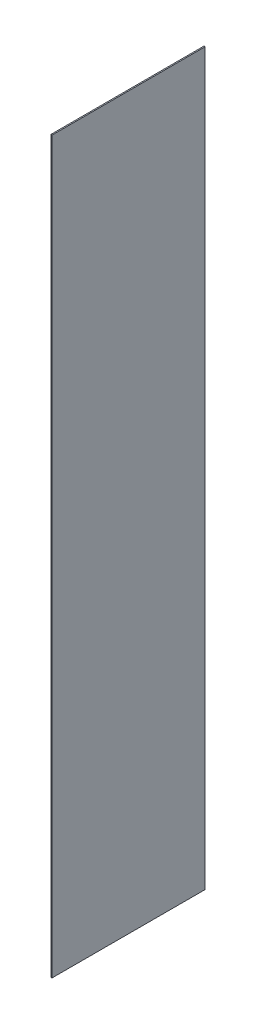
ISO-10303-21;
HEADER;
FILE_DESCRIPTION(('STEP AP214'),'2;1');
FILE_NAME('part.step','',(''),(''),'','','');
FILE_SCHEMA(('AUTOMOTIVE_DESIGN { 1 0 10303 214 1 1 1 1 }'));
ENDSEC;
DATA;
#1=APPLICATION_CONTEXT('core data for automotive mechanical design processes');
#2=APPLICATION_PROTOCOL_DEFINITION('international standard','automotive_design',2000,#1);
#3=PRODUCT_CONTEXT('',#1,'mechanical');
#4=PRODUCT('Part','Part','',(#3));
#5=PRODUCT_RELATED_PRODUCT_CATEGORY('part','',(#4));
#6=PRODUCT_DEFINITION_FORMATION('','',#4);
#7=PRODUCT_DEFINITION_CONTEXT('part definition',#1,'design');
#8=PRODUCT_DEFINITION('design','',#6,#7);
#9=PRODUCT_DEFINITION_SHAPE('','',#8);
#10=(LENGTH_UNIT() NAMED_UNIT(*) SI_UNIT(.MILLI.,.METRE.));
#11=(NAMED_UNIT(*) PLANE_ANGLE_UNIT() SI_UNIT($,.RADIAN.));
#12=(NAMED_UNIT(*) SI_UNIT($,.STERADIAN.) SOLID_ANGLE_UNIT());
#13=UNCERTAINTY_MEASURE_WITH_UNIT(LENGTH_MEASURE(1.E-05),#10,'distance_accuracy_value','');
#14=(GEOMETRIC_REPRESENTATION_CONTEXT(3) GLOBAL_UNCERTAINTY_ASSIGNED_CONTEXT((#13)) GLOBAL_UNIT_ASSIGNED_CONTEXT((#10,
#11,#12)) REPRESENTATION_CONTEXT('',''));
#15=CARTESIAN_POINT('',(0.,0.,0.));
#16=DIRECTION('',(0.,0.,1.));
#17=DIRECTION('',(1.,0.,0.));
#18=AXIS2_PLACEMENT_3D('',#15,#16,#17);
#19=CARTESIAN_POINT('',(823.,-991.,1915.));
#20=DIRECTION('',(1.,0.,0.));
#21=DIRECTION('',(0.,0.,1.));
#22=AXIS2_PLACEMENT_3D('',#19,#20,#21);
#23=PLANE('',#22);
#24=DIRECTION('',(0.,1.,0.));
#25=VECTOR('',#24,1.);
#26=CARTESIAN_POINT('',(823.,-985.,1739.));
#27=LINE('',#26,#25);
#28=CARTESIAN_POINT('',(823.,-985.,1739.));
#29=VERTEX_POINT('',#28);
#30=CARTESIAN_POINT('',(823.,-175.,1739.));
#31=VERTEX_POINT('',#30);
#32=EDGE_CURVE('E11',#29,#31,#27,.T.);
#33=ORIENTED_EDGE('',*,*,#32,.T.);
#34=DIRECTION('',(0.,0.,1.));
#35=VECTOR('',#34,1.);
#36=CARTESIAN_POINT('',(823.,-175.,1739.));
#37=LINE('',#36,#35);
#38=CARTESIAN_POINT('',(823.,-175.,1909.));
#39=VERTEX_POINT('',#38);
#40=EDGE_CURVE('E27',#31,#39,#37,.T.);
#41=ORIENTED_EDGE('',*,*,#40,.T.);
#42=DIRECTION('',(0.,-1.,0.));
#43=VECTOR('',#42,1.);
#44=CARTESIAN_POINT('',(823.,-175.,1909.));
#45=LINE('',#44,#43);
#46=CARTESIAN_POINT('',(823.,-985.,1909.));
#47=VERTEX_POINT('',#46);
#48=EDGE_CURVE('E103',#39,#47,#45,.T.);
#49=ORIENTED_EDGE('',*,*,#48,.T.);
#50=DIRECTION('',(0.,0.,-1.));
#51=VECTOR('',#50,1.);
#52=CARTESIAN_POINT('',(823.,-985.,1909.));
#53=LINE('',#52,#51);
#54=EDGE_CURVE('E106',#47,#29,#53,.T.);
#55=ORIENTED_EDGE('',*,*,#54,.T.);
#56=EDGE_LOOP('',(#33,#41,#49,#55));
#57=FACE_BOUND('',#56,.T.);
#58=ADVANCED_FACE('F17',(#57),#23,.T.);
#59=CARTESIAN_POINT('',(823.,-985.,1909.));
#60=DIRECTION('',(0.,-1.,0.));
#61=DIRECTION('',(1.,0.,0.));
#62=AXIS2_PLACEMENT_3D('',#59,#60,#61);
#63=PLANE('',#62);
#64=DIRECTION('',(-1.,0.,0.));
#65=VECTOR('',#64,1.);
#66=CARTESIAN_POINT('',(823.,-985.,1739.));
#67=LINE('',#66,#65);
#68=CARTESIAN_POINT('',(821.7,-985.,1739.));
#69=VERTEX_POINT('',#68);
#70=EDGE_CURVE('E94',#29,#69,#67,.T.);
#71=ORIENTED_EDGE('',*,*,#70,.F.);
#72=ORIENTED_EDGE('',*,*,#54,.F.);
#73=DIRECTION('',(-1.,0.,0.));
#74=VECTOR('',#73,1.);
#75=CARTESIAN_POINT('',(823.,-985.,1909.));
#76=LINE('',#75,#74);
#77=CARTESIAN_POINT('',(821.7,-985.,1909.));
#78=VERTEX_POINT('',#77);
#79=EDGE_CURVE('E107',#47,#78,#76,.T.);
#80=ORIENTED_EDGE('',*,*,#79,.T.);
#81=DIRECTION('',(0.,0.,1.));
#82=VECTOR('',#81,1.);
#83=CARTESIAN_POINT('',(821.7,-985.,1739.));
#84=LINE('',#83,#82);
#85=EDGE_CURVE('E114',#69,#78,#84,.T.);
#86=ORIENTED_EDGE('',*,*,#85,.F.);
#87=EDGE_LOOP('',(#71,#72,#80,#86));
#88=FACE_BOUND('',#87,.T.);
#89=ADVANCED_FACE('F138',(#88),#63,.T.);
#90=CARTESIAN_POINT('',(821.35,-984.65,1824.));
#91=DIRECTION('',(-0.707106781186548,-0.707106781186548,0.));
#92=DIRECTION('',(0.,0.,1.));
#93=AXIS2_PLACEMENT_3D('',#90,#91,#92);
#94=PLANE('',#93);
#95=DIRECTION('',(-0.577350269189626,0.577350269189626,-0.577350269189626));
#96=VECTOR('',#95,1.);
#97=CARTESIAN_POINT('',(821.7,-985.,1909.));
#98=LINE('',#97,#96);
#99=CARTESIAN_POINT('',(821.,-984.3,1908.3));
#100=VERTEX_POINT('',#99);
#101=EDGE_CURVE('E72',#78,#100,#98,.T.);
#102=ORIENTED_EDGE('',*,*,#101,.T.);
#103=DIRECTION('',(0.,0.,1.));
#104=VECTOR('',#103,1.);
#105=CARTESIAN_POINT('',(821.,-984.3,1739.7));
#106=LINE('',#105,#104);
#107=CARTESIAN_POINT('',(821.,-984.3,1739.7));
#108=VERTEX_POINT('',#107);
#109=EDGE_CURVE('E66',#108,#100,#106,.T.);
#110=ORIENTED_EDGE('',*,*,#109,.F.);
#111=DIRECTION('',(-0.577350269189626,0.577350269189626,0.577350269189626));
#112=VECTOR('',#111,1.);
#113=CARTESIAN_POINT('',(821.7,-985.,1739.));
#114=LINE('',#113,#112);
#115=EDGE_CURVE('E69',#69,#108,#114,.T.);
#116=ORIENTED_EDGE('',*,*,#115,.F.);
#117=ORIENTED_EDGE('',*,*,#85,.T.);
#118=EDGE_LOOP('',(#102,#110,#116,#117));
#119=FACE_BOUND('',#118,.T.);
#120=ADVANCED_FACE('F68',(#119),#94,.T.);
#121=CARTESIAN_POINT('',(821.35,-580.,1739.35));
#122=DIRECTION('',(-0.707106781186498,0.,-0.707106781186598));
#123=DIRECTION('',(-0.707106781186598,0.,0.707106781186498));
#124=AXIS2_PLACEMENT_3D('',#121,#122,#123);
#125=PLANE('',#124);
#126=DIRECTION('',(-0.577350269189592,-0.577350269189693,0.577350269189592));
#127=VECTOR('',#126,1.);
#128=CARTESIAN_POINT('',(821.7,-175.,1739.));
#129=LINE('',#128,#127);
#130=CARTESIAN_POINT('',(821.7,-175.,1739.));
#131=VERTEX_POINT('',#130);
#132=CARTESIAN_POINT('',(821.,-175.7,1739.7));
#133=VERTEX_POINT('',#132);
#134=EDGE_CURVE('E99',#131,#133,#129,.T.);
#135=ORIENTED_EDGE('',*,*,#134,.F.);
#136=DIRECTION('',(0.,-1.,0.));
#137=VECTOR('',#136,1.);
#138=CARTESIAN_POINT('',(821.7,-175.,1739.));
#139=LINE('',#138,#137);
#140=EDGE_CURVE('E85',#131,#69,#139,.T.);
#141=ORIENTED_EDGE('',*,*,#140,.T.);
#142=ORIENTED_EDGE('',*,*,#115,.T.);
#143=DIRECTION('',(0.,-1.,0.));
#144=VECTOR('',#143,1.);
#145=CARTESIAN_POINT('',(821.,-175.7,1739.7));
#146=LINE('',#145,#144);
#147=EDGE_CURVE('E76',#133,#108,#146,.T.);
#148=ORIENTED_EDGE('',*,*,#147,.F.);
#149=EDGE_LOOP('',(#135,#141,#142,#148));
#150=FACE_BOUND('',#149,.T.);
#151=ADVANCED_FACE('F82',(#150),#125,.T.);
#152=CARTESIAN_POINT('',(821.,-991.,1915.));
#153=DIRECTION('',(1.,0.,0.));
#154=DIRECTION('',(0.,0.,1.));
#155=AXIS2_PLACEMENT_3D('',#152,#153,#154);
#156=PLANE('',#155);
#157=DIRECTION('',(0.,0.,-1.));
#158=VECTOR('',#157,1.);
#159=CARTESIAN_POINT('',(821.,-175.7,1908.3));
#160=LINE('',#159,#158);
#161=CARTESIAN_POINT('',(821.,-175.7,1908.3));
#162=VERTEX_POINT('',#161);
#163=EDGE_CURVE('E86',#162,#133,#160,.T.);
#164=ORIENTED_EDGE('',*,*,#163,.T.);
#165=ORIENTED_EDGE('',*,*,#147,.T.);
#166=ORIENTED_EDGE('',*,*,#109,.T.);
#167=DIRECTION('',(0.,1.,0.));
#168=VECTOR('',#167,1.);
#169=CARTESIAN_POINT('',(821.,-984.3,1908.3));
#170=LINE('',#169,#168);
#171=EDGE_CURVE('E77',#100,#162,#170,.T.);
#172=ORIENTED_EDGE('',*,*,#171,.T.);
#173=EDGE_LOOP('',(#164,#165,#166,#172));
#174=FACE_BOUND('',#173,.T.);
#175=ADVANCED_FACE('F88',(#174),#156,.F.);
#176=CARTESIAN_POINT('',(821.35,-580.,1908.65));
#177=DIRECTION('',(-0.707106781186548,0.,0.707106781186548));
#178=DIRECTION('',(0.,-1.,0.));
#179=AXIS2_PLACEMENT_3D('',#176,#177,#178);
#180=PLANE('',#179);
#181=DIRECTION('',(-0.577350269189592,-0.577350269189693,-0.577350269189592));
#182=VECTOR('',#181,1.);
#183=CARTESIAN_POINT('',(821.7,-175.,1909.));
#184=LINE('',#183,#182);
#185=CARTESIAN_POINT('',(821.7,-175.,1909.));
#186=VERTEX_POINT('',#185);
#187=EDGE_CURVE('E112',#186,#162,#184,.T.);
#188=ORIENTED_EDGE('',*,*,#187,.T.);
#189=ORIENTED_EDGE('',*,*,#171,.F.);
#190=ORIENTED_EDGE('',*,*,#101,.F.);
#191=DIRECTION('',(0.,1.,0.));
#192=VECTOR('',#191,1.);
#193=CARTESIAN_POINT('',(821.7,-985.,1909.));
#194=LINE('',#193,#192);
#195=EDGE_CURVE('E109',#78,#186,#194,.T.);
#196=ORIENTED_EDGE('',*,*,#195,.T.);
#197=EDGE_LOOP('',(#188,#189,#190,#196));
#198=FACE_BOUND('',#197,.T.);
#199=ADVANCED_FACE('F128',(#198),#180,.T.);
#200=CARTESIAN_POINT('',(823.,-175.,1909.));
#201=DIRECTION('',(0.,0.,1.));
#202=DIRECTION('',(1.,0.,0.));
#203=AXIS2_PLACEMENT_3D('',#200,#201,#202);
#204=PLANE('',#203);
#205=ORIENTED_EDGE('',*,*,#79,.F.);
#206=ORIENTED_EDGE('',*,*,#48,.F.);
#207=DIRECTION('',(-1.,0.,0.));
#208=VECTOR('',#207,1.);
#209=CARTESIAN_POINT('',(823.,-175.,1909.));
#210=LINE('',#209,#208);
#211=EDGE_CURVE('E21',#39,#186,#210,.T.);
#212=ORIENTED_EDGE('',*,*,#211,.T.);
#213=ORIENTED_EDGE('',*,*,#195,.F.);
#214=EDGE_LOOP('',(#205,#206,#212,#213));
#215=FACE_BOUND('',#214,.T.);
#216=ADVANCED_FACE('F131',(#215),#204,.T.);
#217=CARTESIAN_POINT('',(823.,-175.,1739.));
#218=DIRECTION('',(0.,1.,0.));
#219=DIRECTION('',(0.,0.,-1.));
#220=AXIS2_PLACEMENT_3D('',#217,#218,#219);
#221=PLANE('',#220);
#222=ORIENTED_EDGE('',*,*,#211,.F.);
#223=ORIENTED_EDGE('',*,*,#40,.F.);
#224=DIRECTION('',(-1.,0.,0.));
#225=VECTOR('',#224,1.);
#226=CARTESIAN_POINT('',(823.,-175.,1739.));
#227=LINE('',#226,#225);
#228=EDGE_CURVE('E96',#31,#131,#227,.T.);
#229=ORIENTED_EDGE('',*,*,#228,.T.);
#230=DIRECTION('',(0.,0.,-1.));
#231=VECTOR('',#230,1.);
#232=CARTESIAN_POINT('',(821.7,-175.,1909.));
#233=LINE('',#232,#231);
#234=EDGE_CURVE('E98',#186,#131,#233,.T.);
#235=ORIENTED_EDGE('',*,*,#234,.F.);
#236=EDGE_LOOP('',(#222,#223,#229,#235));
#237=FACE_BOUND('',#236,.T.);
#238=ADVANCED_FACE('F132',(#237),#221,.T.);
#239=CARTESIAN_POINT('',(821.35,-175.35,1824.));
#240=DIRECTION('',(-0.707106781186598,0.707106781186498,0.));
#241=DIRECTION('',(-0.707106781186498,-0.707106781186598,0.));
#242=AXIS2_PLACEMENT_3D('',#239,#240,#241);
#243=PLANE('',#242);
#244=ORIENTED_EDGE('',*,*,#187,.F.);
#245=ORIENTED_EDGE('',*,*,#234,.T.);
#246=ORIENTED_EDGE('',*,*,#134,.T.);
#247=ORIENTED_EDGE('',*,*,#163,.F.);
#248=EDGE_LOOP('',(#244,#245,#246,#247));
#249=FACE_BOUND('',#248,.T.);
#250=ADVANCED_FACE('F19',(#249),#243,.T.);
#251=CARTESIAN_POINT('',(823.,-985.,1739.));
#252=DIRECTION('',(0.,0.,-1.));
#253=DIRECTION('',(0.,1.,0.));
#254=AXIS2_PLACEMENT_3D('',#251,#252,#253);
#255=PLANE('',#254);
#256=ORIENTED_EDGE('',*,*,#228,.F.);
#257=ORIENTED_EDGE('',*,*,#32,.F.);
#258=ORIENTED_EDGE('',*,*,#70,.T.);
#259=ORIENTED_EDGE('',*,*,#140,.F.);
#260=EDGE_LOOP('',(#256,#257,#258,#259));
#261=FACE_BOUND('',#260,.T.);
#262=ADVANCED_FACE('F136',(#261),#255,.T.);
#263=CLOSED_SHELL('',(#58,#89,#120,#151,#175,#199,#216,#238,#250,#262));
#264=MANIFOLD_SOLID_BREP('B1',#263);
#265=ADVANCED_BREP_SHAPE_REPRESENTATION('',(#18,#264),#14);
#266=SHAPE_DEFINITION_REPRESENTATION(#9,#265);
ENDSEC;
END-ISO-10303-21;
